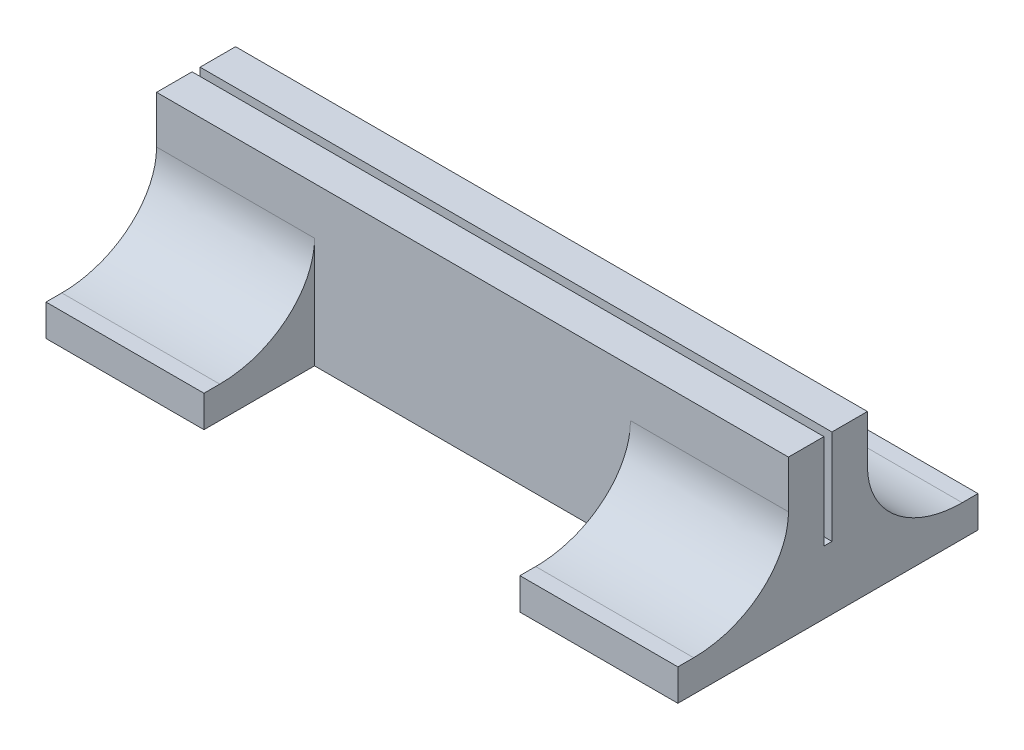
ISO-10303-21;
HEADER;
FILE_DESCRIPTION(('STEP AP214'),'2;1');
FILE_NAME('part.step','',(''),(''),'','','');
FILE_SCHEMA(('AUTOMOTIVE_DESIGN { 1 0 10303 214 1 1 1 1 }'));
ENDSEC;
DATA;
#1=APPLICATION_CONTEXT('core data for automotive mechanical design processes');
#2=APPLICATION_PROTOCOL_DEFINITION('international standard','automotive_design',2000,#1);
#3=PRODUCT_CONTEXT('',#1,'mechanical');
#4=PRODUCT('Part','Part','',(#3));
#5=PRODUCT_RELATED_PRODUCT_CATEGORY('part','',(#4));
#6=PRODUCT_DEFINITION_FORMATION('','',#4);
#7=PRODUCT_DEFINITION_CONTEXT('part definition',#1,'design');
#8=PRODUCT_DEFINITION('design','',#6,#7);
#9=PRODUCT_DEFINITION_SHAPE('','',#8);
#10=(LENGTH_UNIT() NAMED_UNIT(*) SI_UNIT(.MILLI.,.METRE.));
#11=(NAMED_UNIT(*) PLANE_ANGLE_UNIT() SI_UNIT($,.RADIAN.));
#12=(NAMED_UNIT(*) SI_UNIT($,.STERADIAN.) SOLID_ANGLE_UNIT());
#13=UNCERTAINTY_MEASURE_WITH_UNIT(LENGTH_MEASURE(1.E-05),#10,'distance_accuracy_value','');
#14=(GEOMETRIC_REPRESENTATION_CONTEXT(3) GLOBAL_UNCERTAINTY_ASSIGNED_CONTEXT((#13)) GLOBAL_UNIT_ASSIGNED_CONTEXT((#10,
#11,#12)) REPRESENTATION_CONTEXT('',''));
#15=CARTESIAN_POINT('',(0.,0.,0.));
#16=DIRECTION('',(0.,0.,1.));
#17=DIRECTION('',(1.,0.,0.));
#18=AXIS2_PLACEMENT_3D('',#15,#16,#17);
#19=CARTESIAN_POINT('',(-20.,10.,-2.5));
#20=DIRECTION('',(0.,0.,1.));
#21=DIRECTION('',(1.,0.,0.));
#22=AXIS2_PLACEMENT_3D('',#19,#20,#21);
#23=PLANE('',#22);
#24=DIRECTION('',(0.,1.,0.));
#25=VECTOR('',#24,1.);
#26=CARTESIAN_POINT('',(-10.,10.,-2.5));
#27=LINE('',#26,#25);
#28=CARTESIAN_POINT('',(-10.,0.,-2.5));
#29=VERTEX_POINT('',#28);
#30=CARTESIAN_POINT('',(-10.,7.,-2.5));
#31=VERTEX_POINT('',#30);
#32=EDGE_CURVE('E670',#29,#31,#27,.T.);
#33=ORIENTED_EDGE('',*,*,#32,.T.);
#34=CARTESIAN_POINT('',(-20.5,7.,-2.5));
#35=CARTESIAN_POINT('',(-16.8333333333333,7.,-2.5));
#36=CARTESIAN_POINT('',(-13.1666666666667,7.,-2.5));
#37=CARTESIAN_POINT('',(-9.5,7.,-2.5));
#38=(BOUNDED_CURVE() B_SPLINE_CURVE(3,(#34,#35,#36,#37),.UNSPECIFIED.,.F.,
.F.) B_SPLINE_CURVE_WITH_KNOTS((4,4),(-0.0105,0.0005),
.UNSPECIFIED.) CURVE() GEOMETRIC_REPRESENTATION_ITEM() RATIONAL_B_SPLINE_CURVE((1.,1.,1.,1.)) REPRESENTATION_ITEM(''));
#39=CARTESIAN_POINT('',(-20.,7.,-2.5));
#40=VERTEX_POINT('',#39);
#41=EDGE_CURVE('E562',#31,#40,#38,.F.);
#42=ORIENTED_EDGE('',*,*,#41,.T.);
#43=DIRECTION('',(0.,-1.,0.));
#44=VECTOR('',#43,1.);
#45=CARTESIAN_POINT('',(-20.,10.,-2.5));
#46=LINE('',#45,#44);
#47=CARTESIAN_POINT('',(-20.,10.,-2.5));
#48=VERTEX_POINT('',#47);
#49=EDGE_CURVE('E323',#48,#40,#46,.T.);
#50=ORIENTED_EDGE('',*,*,#49,.F.);
#51=DIRECTION('',(-1.,0.,0.));
#52=VECTOR('',#51,1.);
#53=CARTESIAN_POINT('',(-20.,10.,-2.5));
#54=LINE('',#53,#52);
#55=CARTESIAN_POINT('',(20.,10.,-2.5));
#56=VERTEX_POINT('',#55);
#57=EDGE_CURVE('E771',#56,#48,#54,.T.);
#58=ORIENTED_EDGE('',*,*,#57,.F.);
#59=DIRECTION('',(0.,-1.,0.));
#60=VECTOR('',#59,1.);
#61=CARTESIAN_POINT('',(20.,10.,-2.5));
#62=LINE('',#61,#60);
#63=CARTESIAN_POINT('',(20.,7.,-2.5));
#64=VERTEX_POINT('',#63);
#65=EDGE_CURVE('E277',#56,#64,#62,.T.);
#66=ORIENTED_EDGE('',*,*,#65,.T.);
#67=CARTESIAN_POINT('',(9.5,7.,-2.5));
#68=CARTESIAN_POINT('',(13.1666666666667,7.,-2.5));
#69=CARTESIAN_POINT('',(16.8333333333333,7.,-2.5));
#70=CARTESIAN_POINT('',(20.5,7.,-2.5));
#71=(BOUNDED_CURVE() B_SPLINE_CURVE(3,(#67,#68,#69,#70),.UNSPECIFIED.,.F.,
.F.) B_SPLINE_CURVE_WITH_KNOTS((4,4),(-0.0005,0.0105),
.UNSPECIFIED.) CURVE() GEOMETRIC_REPRESENTATION_ITEM() RATIONAL_B_SPLINE_CURVE((1.,1.,1.,1.)) REPRESENTATION_ITEM(''));
#72=CARTESIAN_POINT('',(10.,7.,-2.5));
#73=VERTEX_POINT('',#72);
#74=EDGE_CURVE('E1043',#64,#73,#71,.F.);
#75=ORIENTED_EDGE('',*,*,#74,.T.);
#76=DIRECTION('',(0.,1.,0.));
#77=VECTOR('',#76,1.);
#78=CARTESIAN_POINT('',(10.,10.,-2.5));
#79=LINE('',#78,#77);
#80=CARTESIAN_POINT('',(10.,0.,-2.5));
#81=VERTEX_POINT('',#80);
#82=EDGE_CURVE('E546',#81,#73,#79,.T.);
#83=ORIENTED_EDGE('',*,*,#82,.F.);
#84=DIRECTION('',(-1.,0.,0.));
#85=VECTOR('',#84,1.);
#86=CARTESIAN_POINT('',(-20.,0.,-2.5));
#87=LINE('',#86,#85);
#88=EDGE_CURVE('E759',#81,#29,#87,.T.);
#89=ORIENTED_EDGE('',*,*,#88,.T.);
#90=EDGE_LOOP('',(#33,#42,#50,#58,#66,#75,#83,#89));
#91=FACE_BOUND('',#90,.T.);
#92=ADVANCED_FACE('F38',(#91),#23,.F.);
#93=CARTESIAN_POINT('',(-20.,10.,2.5));
#94=DIRECTION('',(0.,0.,-1.));
#95=DIRECTION('',(-1.,0.,0.));
#96=AXIS2_PLACEMENT_3D('',#93,#94,#95);
#97=PLANE('',#96);
#98=DIRECTION('',(0.,-1.,0.));
#99=VECTOR('',#98,1.);
#100=CARTESIAN_POINT('',(10.,10.,2.5));
#101=LINE('',#100,#99);
#102=CARTESIAN_POINT('',(9.99999999999999,7.,2.5));
#103=VERTEX_POINT('',#102);
#104=CARTESIAN_POINT('',(10.,0.,2.5));
#105=VERTEX_POINT('',#104);
#106=EDGE_CURVE('E249',#103,#105,#101,.T.);
#107=ORIENTED_EDGE('',*,*,#106,.F.);
#108=CARTESIAN_POINT('',(20.5,7.,2.5));
#109=CARTESIAN_POINT('',(16.8333333333333,7.,2.5));
#110=CARTESIAN_POINT('',(13.1666666666667,7.,2.5));
#111=CARTESIAN_POINT('',(9.5,7.,2.5));
#112=(BOUNDED_CURVE() B_SPLINE_CURVE(3,(#108,#109,#110,#111),.UNSPECIFIED.,.F.,
.F.) B_SPLINE_CURVE_WITH_KNOTS((4,4),(-0.0105,0.0005),
.UNSPECIFIED.) CURVE() GEOMETRIC_REPRESENTATION_ITEM() RATIONAL_B_SPLINE_CURVE((1.,1.,1.,1.)) REPRESENTATION_ITEM(''));
#113=CARTESIAN_POINT('',(20.,7.,2.5));
#114=VERTEX_POINT('',#113);
#115=EDGE_CURVE('E1044',#103,#114,#112,.F.);
#116=ORIENTED_EDGE('',*,*,#115,.T.);
#117=DIRECTION('',(0.,-1.,0.));
#118=VECTOR('',#117,1.);
#119=CARTESIAN_POINT('',(20.,10.,2.5));
#120=LINE('',#119,#118);
#121=CARTESIAN_POINT('',(20.,10.,2.5));
#122=VERTEX_POINT('',#121);
#123=EDGE_CURVE('E301',#122,#114,#120,.T.);
#124=ORIENTED_EDGE('',*,*,#123,.F.);
#125=DIRECTION('',(1.,0.,0.));
#126=VECTOR('',#125,1.);
#127=CARTESIAN_POINT('',(-20.,10.,2.5));
#128=LINE('',#127,#126);
#129=CARTESIAN_POINT('',(-20.,10.,2.5));
#130=VERTEX_POINT('',#129);
#131=EDGE_CURVE('E310',#130,#122,#128,.T.);
#132=ORIENTED_EDGE('',*,*,#131,.F.);
#133=DIRECTION('',(0.,-1.,0.));
#134=VECTOR('',#133,1.);
#135=CARTESIAN_POINT('',(-20.,10.,2.5));
#136=LINE('',#135,#134);
#137=CARTESIAN_POINT('',(-20.,7.,2.5));
#138=VERTEX_POINT('',#137);
#139=EDGE_CURVE('E309',#130,#138,#136,.T.);
#140=ORIENTED_EDGE('',*,*,#139,.T.);
#141=CARTESIAN_POINT('',(-9.5,7.,2.5));
#142=CARTESIAN_POINT('',(-13.1666666666667,7.,2.5));
#143=CARTESIAN_POINT('',(-16.8333333333333,7.,2.5));
#144=CARTESIAN_POINT('',(-20.5,7.,2.5));
#145=(BOUNDED_CURVE() B_SPLINE_CURVE(3,(#141,#142,#143,#144),.UNSPECIFIED.,.F.,
.F.) B_SPLINE_CURVE_WITH_KNOTS((4,4),(-0.0005,0.0105),
.UNSPECIFIED.) CURVE() GEOMETRIC_REPRESENTATION_ITEM() RATIONAL_B_SPLINE_CURVE((1.,1.,1.,1.)) REPRESENTATION_ITEM(''));
#146=CARTESIAN_POINT('',(-10.,7.,2.5));
#147=VERTEX_POINT('',#146);
#148=EDGE_CURVE('E330',#138,#147,#145,.F.);
#149=ORIENTED_EDGE('',*,*,#148,.T.);
#150=DIRECTION('',(0.,-1.,0.));
#151=VECTOR('',#150,1.);
#152=CARTESIAN_POINT('',(-10.,10.,2.5));
#153=LINE('',#152,#151);
#154=CARTESIAN_POINT('',(-10.,0.,2.5));
#155=VERTEX_POINT('',#154);
#156=EDGE_CURVE('E677',#147,#155,#153,.T.);
#157=ORIENTED_EDGE('',*,*,#156,.T.);
#158=DIRECTION('',(1.,0.,0.));
#159=VECTOR('',#158,1.);
#160=CARTESIAN_POINT('',(-20.,0.,2.5));
#161=LINE('',#160,#159);
#162=EDGE_CURVE('E315',#155,#105,#161,.T.);
#163=ORIENTED_EDGE('',*,*,#162,.T.);
#164=EDGE_LOOP('',(#107,#116,#124,#132,#140,#149,#157,#163));
#165=FACE_BOUND('',#164,.T.);
#166=ADVANCED_FACE('F338',(#165),#97,.F.);
#167=CARTESIAN_POINT('',(0.,10.,0.));
#168=DIRECTION('',(0.,1.,0.));
#169=DIRECTION('',(0.,0.,1.));
#170=AXIS2_PLACEMENT_3D('',#167,#168,#169);
#171=PLANE('',#170);
#172=DIRECTION('',(-1.,0.,0.));
#173=VECTOR('',#172,1.);
#174=CARTESIAN_POINT('',(20.,10.,-0.254179669127552));
#175=LINE('',#174,#173);
#176=CARTESIAN_POINT('',(20.,10.,-0.254179669127552));
#177=VERTEX_POINT('',#176);
#178=CARTESIAN_POINT('',(-20.,10.,-0.254179669127552));
#179=VERTEX_POINT('',#178);
#180=EDGE_CURVE('E678',#177,#179,#175,.T.);
#181=ORIENTED_EDGE('',*,*,#180,.F.);
#182=DIRECTION('',(0.,0.,-1.));
#183=VECTOR('',#182,1.);
#184=CARTESIAN_POINT('',(20.,10.,-2.5));
#185=LINE('',#184,#183);
#186=EDGE_CURVE('E764',#177,#56,#185,.T.);
#187=ORIENTED_EDGE('',*,*,#186,.T.);
#188=ORIENTED_EDGE('',*,*,#57,.T.);
#189=DIRECTION('',(0.,0.,1.));
#190=VECTOR('',#189,1.);
#191=CARTESIAN_POINT('',(-20.,10.,-2.5));
#192=LINE('',#191,#190);
#193=EDGE_CURVE('E750',#48,#179,#192,.T.);
#194=ORIENTED_EDGE('',*,*,#193,.T.);
#195=EDGE_LOOP('',(#181,#187,#188,#194));
#196=FACE_BOUND('',#195,.T.);
#197=ADVANCED_FACE('F348',(#196),#171,.T.);
#198=CARTESIAN_POINT('',(20.,10.,-2.5));
#199=DIRECTION('',(-1.,0.,0.));
#200=DIRECTION('',(0.,0.,1.));
#201=AXIS2_PLACEMENT_3D('',#198,#199,#200);
#202=PLANE('',#201);
#203=DIRECTION('',(0.,0.,-1.));
#204=VECTOR('',#203,1.);
#205=CARTESIAN_POINT('',(20.,0.,-2.5));
#206=LINE('',#205,#204);
#207=CARTESIAN_POINT('',(20.,0.,9.5));
#208=VERTEX_POINT('',#207);
#209=CARTESIAN_POINT('',(20.,0.,-9.5));
#210=VERTEX_POINT('',#209);
#211=EDGE_CURVE('E757',#208,#210,#206,.T.);
#212=ORIENTED_EDGE('',*,*,#211,.T.);
#213=DIRECTION('',(0.,-1.,0.));
#214=VECTOR('',#213,1.);
#215=CARTESIAN_POINT('',(20.,0.,-9.5));
#216=LINE('',#215,#214);
#217=CARTESIAN_POINT('',(20.,2.,-9.5));
#218=VERTEX_POINT('',#217);
#219=EDGE_CURVE('E238',#218,#210,#216,.T.);
#220=ORIENTED_EDGE('',*,*,#219,.F.);
#221=DIRECTION('',(0.,0.,1.));
#222=VECTOR('',#221,1.);
#223=CARTESIAN_POINT('',(20.,2.,-9.5));
#224=LINE('',#223,#222);
#225=CARTESIAN_POINT('',(20.,2.,-8.5));
#226=VERTEX_POINT('',#225);
#227=EDGE_CURVE('E218',#218,#226,#224,.T.);
#228=ORIENTED_EDGE('',*,*,#227,.T.);
#229=CARTESIAN_POINT('',(20.,7.,-2.5));
#230=CARTESIAN_POINT('',(20.,2.,-2.5));
#231=CARTESIAN_POINT('',(20.,2.,-8.5));
#232=(BOUNDED_CURVE() B_SPLINE_CURVE(2,(#229,#230,#231),.UNSPECIFIED.,.F.,
.F.) B_SPLINE_CURVE_WITH_KNOTS((3,3),(0.,1.),
.UNSPECIFIED.) CURVE() GEOMETRIC_REPRESENTATION_ITEM() RATIONAL_B_SPLINE_CURVE((1.,
0.707106781186548,1.)) REPRESENTATION_ITEM(''));
#233=EDGE_CURVE('E425',#226,#64,#232,.F.);
#234=ORIENTED_EDGE('',*,*,#233,.T.);
#235=ORIENTED_EDGE('',*,*,#65,.F.);
#236=ORIENTED_EDGE('',*,*,#186,.F.);
#237=DIRECTION('',(0.,1.,0.));
#238=VECTOR('',#237,1.);
#239=CARTESIAN_POINT('',(20.,4.,-0.254179669127552));
#240=LINE('',#239,#238);
#241=CARTESIAN_POINT('',(20.,4.,-0.254179669127552));
#242=VERTEX_POINT('',#241);
#243=EDGE_CURVE('E786',#242,#177,#240,.T.);
#244=ORIENTED_EDGE('',*,*,#243,.F.);
#245=DIRECTION('',(0.,0.,-1.));
#246=VECTOR('',#245,1.);
#247=CARTESIAN_POINT('',(20.,4.,0.254179669127552));
#248=LINE('',#247,#246);
#249=CARTESIAN_POINT('',(20.,4.,0.254179669127552));
#250=VERTEX_POINT('',#249);
#251=EDGE_CURVE('E788',#250,#242,#248,.T.);
#252=ORIENTED_EDGE('',*,*,#251,.F.);
#253=DIRECTION('',(0.,1.,0.));
#254=VECTOR('',#253,1.);
#255=CARTESIAN_POINT('',(20.,4.,0.254179669127552));
#256=LINE('',#255,#254);
#257=CARTESIAN_POINT('',(20.,10.,0.254179669127552));
#258=VERTEX_POINT('',#257);
#259=EDGE_CURVE('E783',#250,#258,#256,.T.);
#260=ORIENTED_EDGE('',*,*,#259,.T.);
#261=EDGE_CURVE('E765',#122,#258,#185,.T.);
#262=ORIENTED_EDGE('',*,*,#261,.F.);
#263=ORIENTED_EDGE('',*,*,#123,.T.);
#264=CARTESIAN_POINT('',(20.,2.,8.5));
#265=CARTESIAN_POINT('',(20.,2.,2.5));
#266=CARTESIAN_POINT('',(20.,7.,2.5));
#267=(BOUNDED_CURVE() B_SPLINE_CURVE(2,(#264,#265,#266),.UNSPECIFIED.,.F.,
.F.) B_SPLINE_CURVE_WITH_KNOTS((3,3),(0.,1.),
.UNSPECIFIED.) CURVE() GEOMETRIC_REPRESENTATION_ITEM() RATIONAL_B_SPLINE_CURVE((1.,
0.707106781186548,1.)) REPRESENTATION_ITEM(''));
#268=CARTESIAN_POINT('',(20.,2.,8.5));
#269=VERTEX_POINT('',#268);
#270=EDGE_CURVE('E212',#114,#269,#267,.F.);
#271=ORIENTED_EDGE('',*,*,#270,.T.);
#272=CARTESIAN_POINT('',(20.,2.,9.5));
#273=VERTEX_POINT('',#272);
#274=EDGE_CURVE('E205',#269,#273,#224,.T.);
#275=ORIENTED_EDGE('',*,*,#274,.T.);
#276=DIRECTION('',(0.,-1.,0.));
#277=VECTOR('',#276,1.);
#278=CARTESIAN_POINT('',(20.,0.,9.5));
#279=LINE('',#278,#277);
#280=EDGE_CURVE('E208',#273,#208,#279,.T.);
#281=ORIENTED_EDGE('',*,*,#280,.T.);
#282=EDGE_LOOP('',(#212,#220,#228,#234,#235,#236,#244,#252,#260,#262,#263,#271,#275,#281));
#283=FACE_BOUND('',#282,.T.);
#284=ADVANCED_FACE('F207',(#283),#202,.F.);
#285=CARTESIAN_POINT('',(-20.,10.,-2.5));
#286=DIRECTION('',(1.,0.,0.));
#287=DIRECTION('',(0.,0.,-1.));
#288=AXIS2_PLACEMENT_3D('',#285,#286,#287);
#289=PLANE('',#288);
#290=ORIENTED_EDGE('',*,*,#49,.T.);
#291=CARTESIAN_POINT('',(-20.,2.,-8.5));
#292=CARTESIAN_POINT('',(-20.,2.,-2.5));
#293=CARTESIAN_POINT('',(-20.,7.,-2.5));
#294=(BOUNDED_CURVE() B_SPLINE_CURVE(2,(#291,#292,#293),.UNSPECIFIED.,.F.,
.F.) B_SPLINE_CURVE_WITH_KNOTS((3,3),(0.,1.),
.UNSPECIFIED.) CURVE() GEOMETRIC_REPRESENTATION_ITEM() RATIONAL_B_SPLINE_CURVE((1.,
0.707106781186548,1.)) REPRESENTATION_ITEM(''));
#295=CARTESIAN_POINT('',(-20.,2.,-8.5));
#296=VERTEX_POINT('',#295);
#297=EDGE_CURVE('E51',#40,#296,#294,.F.);
#298=ORIENTED_EDGE('',*,*,#297,.T.);
#299=DIRECTION('',(0.,0.,1.));
#300=VECTOR('',#299,1.);
#301=CARTESIAN_POINT('',(-20.,2.,-9.5));
#302=LINE('',#301,#300);
#303=CARTESIAN_POINT('',(-20.,2.,-9.5));
#304=VERTEX_POINT('',#303);
#305=EDGE_CURVE('E575',#304,#296,#302,.T.);
#306=ORIENTED_EDGE('',*,*,#305,.F.);
#307=DIRECTION('',(0.,-1.,0.));
#308=VECTOR('',#307,1.);
#309=CARTESIAN_POINT('',(-20.,0.,-9.5));
#310=LINE('',#309,#308);
#311=CARTESIAN_POINT('',(-20.,0.,-9.5));
#312=VERTEX_POINT('',#311);
#313=EDGE_CURVE('E815',#304,#312,#310,.T.);
#314=ORIENTED_EDGE('',*,*,#313,.T.);
#315=DIRECTION('',(0.,0.,1.));
#316=VECTOR('',#315,1.);
#317=CARTESIAN_POINT('',(-20.,0.,-2.5));
#318=LINE('',#317,#316);
#319=CARTESIAN_POINT('',(-20.,0.,9.5));
#320=VERTEX_POINT('',#319);
#321=EDGE_CURVE('E761',#312,#320,#318,.T.);
#322=ORIENTED_EDGE('',*,*,#321,.T.);
#323=DIRECTION('',(0.,-1.,0.));
#324=VECTOR('',#323,1.);
#325=CARTESIAN_POINT('',(-20.,0.,9.5));
#326=LINE('',#325,#324);
#327=CARTESIAN_POINT('',(-20.,2.,9.5));
#328=VERTEX_POINT('',#327);
#329=EDGE_CURVE('E553',#328,#320,#326,.T.);
#330=ORIENTED_EDGE('',*,*,#329,.F.);
#331=CARTESIAN_POINT('',(-20.,2.,8.5));
#332=VERTEX_POINT('',#331);
#333=EDGE_CURVE('E335',#332,#328,#302,.T.);
#334=ORIENTED_EDGE('',*,*,#333,.F.);
#335=CARTESIAN_POINT('',(-20.,7.,2.5));
#336=CARTESIAN_POINT('',(-20.,2.,2.5));
#337=CARTESIAN_POINT('',(-20.,2.,8.5));
#338=(BOUNDED_CURVE() B_SPLINE_CURVE(2,(#335,#336,#337),.UNSPECIFIED.,.F.,
.F.) B_SPLINE_CURVE_WITH_KNOTS((3,3),(0.,1.),
.UNSPECIFIED.) CURVE() GEOMETRIC_REPRESENTATION_ITEM() RATIONAL_B_SPLINE_CURVE((1.,
0.707106781186547,1.)) REPRESENTATION_ITEM(''));
#339=EDGE_CURVE('E706',#332,#138,#338,.F.);
#340=ORIENTED_EDGE('',*,*,#339,.T.);
#341=ORIENTED_EDGE('',*,*,#139,.F.);
#342=CARTESIAN_POINT('',(-20.,10.,0.254179669127552));
#343=VERTEX_POINT('',#342);
#344=EDGE_CURVE('E753',#343,#130,#192,.T.);
#345=ORIENTED_EDGE('',*,*,#344,.F.);
#346=DIRECTION('',(0.,1.,0.));
#347=VECTOR('',#346,1.);
#348=CARTESIAN_POINT('',(-20.,4.,0.254179669127552));
#349=LINE('',#348,#347);
#350=CARTESIAN_POINT('',(-20.,4.,0.254179669127552));
#351=VERTEX_POINT('',#350);
#352=EDGE_CURVE('E773',#351,#343,#349,.T.);
#353=ORIENTED_EDGE('',*,*,#352,.F.);
#354=DIRECTION('',(0.,0.,1.));
#355=VECTOR('',#354,1.);
#356=CARTESIAN_POINT('',(-20.,4.,0.254179669127552));
#357=LINE('',#356,#355);
#358=CARTESIAN_POINT('',(-20.,4.,-0.254179669127552));
#359=VERTEX_POINT('',#358);
#360=EDGE_CURVE('E781',#359,#351,#357,.T.);
#361=ORIENTED_EDGE('',*,*,#360,.F.);
#362=DIRECTION('',(0.,1.,0.));
#363=VECTOR('',#362,1.);
#364=CARTESIAN_POINT('',(-20.,4.,-0.254179669127552));
#365=LINE('',#364,#363);
#366=EDGE_CURVE('E760',#359,#179,#365,.T.);
#367=ORIENTED_EDGE('',*,*,#366,.T.);
#368=ORIENTED_EDGE('',*,*,#193,.F.);
#369=EDGE_LOOP('',(#290,#298,#306,#314,#322,#330,#334,#340,#341,#345,#353,#361,#367,#368));
#370=FACE_BOUND('',#369,.T.);
#371=ADVANCED_FACE('F351',(#370),#289,.F.);
#372=DIRECTION('',(1.,0.,0.));
#373=VECTOR('',#372,1.);
#374=CARTESIAN_POINT('',(20.,10.,0.254179669127552));
#375=LINE('',#374,#373);
#376=EDGE_CURVE('E676',#343,#258,#375,.T.);
#377=ORIENTED_EDGE('',*,*,#376,.F.);
#378=ORIENTED_EDGE('',*,*,#344,.T.);
#379=ORIENTED_EDGE('',*,*,#131,.T.);
#380=ORIENTED_EDGE('',*,*,#261,.T.);
#381=EDGE_LOOP('',(#377,#378,#379,#380));
#382=FACE_BOUND('',#381,.T.);
#383=ADVANCED_FACE('F776',(#382),#171,.T.);
#384=CARTESIAN_POINT('',(0.,0.,0.));
#385=DIRECTION('',(0.,1.,0.));
#386=DIRECTION('',(0.,0.,1.));
#387=AXIS2_PLACEMENT_3D('',#384,#385,#386);
#388=PLANE('',#387);
#389=ORIENTED_EDGE('',*,*,#211,.F.);
#390=DIRECTION('',(-1.,0.,0.));
#391=VECTOR('',#390,1.);
#392=CARTESIAN_POINT('',(20.,0.,9.5));
#393=LINE('',#392,#391);
#394=CARTESIAN_POINT('',(10.,0.,9.5));
#395=VERTEX_POINT('',#394);
#396=EDGE_CURVE('E228',#208,#395,#393,.T.);
#397=ORIENTED_EDGE('',*,*,#396,.T.);
#398=DIRECTION('',(0.,0.,1.));
#399=VECTOR('',#398,1.);
#400=CARTESIAN_POINT('',(10.,0.,-9.5));
#401=LINE('',#400,#399);
#402=EDGE_CURVE('E250',#105,#395,#401,.T.);
#403=ORIENTED_EDGE('',*,*,#402,.F.);
#404=ORIENTED_EDGE('',*,*,#162,.F.);
#405=DIRECTION('',(0.,0.,1.));
#406=VECTOR('',#405,1.);
#407=CARTESIAN_POINT('',(-10.,0.,-9.5));
#408=LINE('',#407,#406);
#409=CARTESIAN_POINT('',(-10.,0.,9.5));
#410=VERTEX_POINT('',#409);
#411=EDGE_CURVE('E830',#155,#410,#408,.T.);
#412=ORIENTED_EDGE('',*,*,#411,.T.);
#413=DIRECTION('',(1.,0.,0.));
#414=VECTOR('',#413,1.);
#415=CARTESIAN_POINT('',(-20.,0.,9.5));
#416=LINE('',#415,#414);
#417=EDGE_CURVE('E820',#320,#410,#416,.T.);
#418=ORIENTED_EDGE('',*,*,#417,.F.);
#419=ORIENTED_EDGE('',*,*,#321,.F.);
#420=DIRECTION('',(1.,0.,0.));
#421=VECTOR('',#420,1.);
#422=CARTESIAN_POINT('',(-20.,0.,-9.5));
#423=LINE('',#422,#421);
#424=CARTESIAN_POINT('',(-10.,0.,-9.5));
#425=VERTEX_POINT('',#424);
#426=EDGE_CURVE('E818',#312,#425,#423,.T.);
#427=ORIENTED_EDGE('',*,*,#426,.T.);
#428=EDGE_CURVE('E580',#425,#29,#408,.T.);
#429=ORIENTED_EDGE('',*,*,#428,.T.);
#430=ORIENTED_EDGE('',*,*,#88,.F.);
#431=CARTESIAN_POINT('',(10.,0.,-9.5));
#432=VERTEX_POINT('',#431);
#433=EDGE_CURVE('E246',#432,#81,#401,.T.);
#434=ORIENTED_EDGE('',*,*,#433,.F.);
#435=DIRECTION('',(-1.,0.,0.));
#436=VECTOR('',#435,1.);
#437=CARTESIAN_POINT('',(20.,0.,-9.5));
#438=LINE('',#437,#436);
#439=EDGE_CURVE('E219',#210,#432,#438,.T.);
#440=ORIENTED_EDGE('',*,*,#439,.F.);
#441=EDGE_LOOP('',(#389,#397,#403,#404,#412,#418,#419,#427,#429,#430,#434,#440));
#442=FACE_BOUND('',#441,.T.);
#443=ADVANCED_FACE('F349',(#442),#388,.F.);
#444=CARTESIAN_POINT('',(20.,4.,-0.254179669127552));
#445=DIRECTION('',(0.,0.,-1.));
#446=DIRECTION('',(-1.,0.,0.));
#447=AXIS2_PLACEMENT_3D('',#444,#445,#446);
#448=PLANE('',#447);
#449=ORIENTED_EDGE('',*,*,#180,.T.);
#450=ORIENTED_EDGE('',*,*,#366,.F.);
#451=DIRECTION('',(-1.,0.,0.));
#452=VECTOR('',#451,1.);
#453=CARTESIAN_POINT('',(20.,4.,-0.254179669127552));
#454=LINE('',#453,#452);
#455=EDGE_CURVE('E784',#242,#359,#454,.T.);
#456=ORIENTED_EDGE('',*,*,#455,.F.);
#457=ORIENTED_EDGE('',*,*,#243,.T.);
#458=EDGE_LOOP('',(#449,#450,#456,#457));
#459=FACE_BOUND('',#458,.T.);
#460=ADVANCED_FACE('F800',(#459),#448,.F.);
#461=CARTESIAN_POINT('',(20.,4.,0.254179669127552));
#462=DIRECTION('',(0.,0.,1.));
#463=DIRECTION('',(1.,0.,0.));
#464=AXIS2_PLACEMENT_3D('',#461,#462,#463);
#465=PLANE('',#464);
#466=ORIENTED_EDGE('',*,*,#376,.T.);
#467=ORIENTED_EDGE('',*,*,#259,.F.);
#468=DIRECTION('',(1.,0.,0.));
#469=VECTOR('',#468,1.);
#470=CARTESIAN_POINT('',(20.,4.,0.254179669127552));
#471=LINE('',#470,#469);
#472=EDGE_CURVE('E792',#351,#250,#471,.T.);
#473=ORIENTED_EDGE('',*,*,#472,.F.);
#474=ORIENTED_EDGE('',*,*,#352,.T.);
#475=EDGE_LOOP('',(#466,#467,#473,#474));
#476=FACE_BOUND('',#475,.T.);
#477=ADVANCED_FACE('F891',(#476),#465,.F.);
#478=CARTESIAN_POINT('',(0.,4.,0.));
#479=DIRECTION('',(0.,1.,0.));
#480=DIRECTION('',(0.,0.,1.));
#481=AXIS2_PLACEMENT_3D('',#478,#479,#480);
#482=PLANE('',#481);
#483=ORIENTED_EDGE('',*,*,#360,.T.);
#484=ORIENTED_EDGE('',*,*,#472,.T.);
#485=ORIENTED_EDGE('',*,*,#251,.T.);
#486=ORIENTED_EDGE('',*,*,#455,.T.);
#487=EDGE_LOOP('',(#483,#484,#485,#486));
#488=FACE_BOUND('',#487,.T.);
#489=ADVANCED_FACE('F898',(#488),#482,.T.);
#490=CARTESIAN_POINT('',(0.,0.,9.5));
#491=DIRECTION('',(0.,0.,-1.));
#492=DIRECTION('',(-1.,0.,0.));
#493=AXIS2_PLACEMENT_3D('',#490,#491,#492);
#494=PLANE('',#493);
#495=ORIENTED_EDGE('',*,*,#329,.T.);
#496=ORIENTED_EDGE('',*,*,#417,.T.);
#497=DIRECTION('',(0.,1.,0.));
#498=VECTOR('',#497,1.);
#499=CARTESIAN_POINT('',(-10.,0.,9.5));
#500=LINE('',#499,#498);
#501=CARTESIAN_POINT('',(-10.,2.,9.5));
#502=VERTEX_POINT('',#501);
#503=EDGE_CURVE('E816',#410,#502,#500,.T.);
#504=ORIENTED_EDGE('',*,*,#503,.T.);
#505=DIRECTION('',(-1.,0.,0.));
#506=VECTOR('',#505,1.);
#507=CARTESIAN_POINT('',(-20.,2.,9.5));
#508=LINE('',#507,#506);
#509=EDGE_CURVE('E812',#502,#328,#508,.T.);
#510=ORIENTED_EDGE('',*,*,#509,.T.);
#511=EDGE_LOOP('',(#495,#496,#504,#510));
#512=FACE_BOUND('',#511,.T.);
#513=ADVANCED_FACE('F294',(#512),#494,.F.);
#514=CARTESIAN_POINT('',(-10.,0.,-9.5));
#515=DIRECTION('',(1.,0.,0.));
#516=DIRECTION('',(0.,0.,-1.));
#517=AXIS2_PLACEMENT_3D('',#514,#515,#516);
#518=PLANE('',#517);
#519=ORIENTED_EDGE('',*,*,#156,.F.);
#520=CARTESIAN_POINT('',(-10.,2.,8.5));
#521=CARTESIAN_POINT('',(-10.,2.,2.5));
#522=CARTESIAN_POINT('',(-10.,7.,2.5));
#523=(BOUNDED_CURVE() B_SPLINE_CURVE(2,(#520,#521,#522),.UNSPECIFIED.,.F.,
.F.) B_SPLINE_CURVE_WITH_KNOTS((3,3),(0.,1.),
.UNSPECIFIED.) CURVE() GEOMETRIC_REPRESENTATION_ITEM() RATIONAL_B_SPLINE_CURVE((1.,
0.707106781186548,1.)) REPRESENTATION_ITEM(''));
#524=CARTESIAN_POINT('',(-10.,2.,8.5));
#525=VERTEX_POINT('',#524);
#526=EDGE_CURVE('E725',#147,#525,#523,.F.);
#527=ORIENTED_EDGE('',*,*,#526,.T.);
#528=DIRECTION('',(0.,0.,1.));
#529=VECTOR('',#528,1.);
#530=CARTESIAN_POINT('',(-10.,2.,-9.5));
#531=LINE('',#530,#529);
#532=EDGE_CURVE('E574',#525,#502,#531,.T.);
#533=ORIENTED_EDGE('',*,*,#532,.T.);
#534=ORIENTED_EDGE('',*,*,#503,.F.);
#535=ORIENTED_EDGE('',*,*,#411,.F.);
#536=EDGE_LOOP('',(#519,#527,#533,#534,#535));
#537=FACE_BOUND('',#536,.T.);
#538=ADVANCED_FACE('F807',(#537),#518,.T.);
#539=CARTESIAN_POINT('',(-20.,2.,-9.5));
#540=DIRECTION('',(0.,1.,0.));
#541=DIRECTION('',(0.,0.,1.));
#542=AXIS2_PLACEMENT_3D('',#539,#540,#541);
#543=PLANE('',#542);
#544=ORIENTED_EDGE('',*,*,#532,.F.);
#545=CARTESIAN_POINT('',(-20.5,2.,8.5));
#546=CARTESIAN_POINT('',(-16.8333333333333,2.,8.5));
#547=CARTESIAN_POINT('',(-13.1666666666667,2.,8.5));
#548=CARTESIAN_POINT('',(-9.5,2.,8.5));
#549=(BOUNDED_CURVE() B_SPLINE_CURVE(3,(#545,#546,#547,#548),.UNSPECIFIED.,.F.,
.F.) B_SPLINE_CURVE_WITH_KNOTS((4,4),(-0.0005,0.0105),
.UNSPECIFIED.) CURVE() GEOMETRIC_REPRESENTATION_ITEM() RATIONAL_B_SPLINE_CURVE((1.,1.,1.,1.)) REPRESENTATION_ITEM(''));
#550=EDGE_CURVE('E588',#525,#332,#549,.F.);
#551=ORIENTED_EDGE('',*,*,#550,.T.);
#552=ORIENTED_EDGE('',*,*,#333,.T.);
#553=ORIENTED_EDGE('',*,*,#509,.F.);
#554=EDGE_LOOP('',(#544,#551,#552,#553));
#555=FACE_BOUND('',#554,.T.);
#556=ADVANCED_FACE('F605',(#555),#543,.T.);
#557=ORIENTED_EDGE('',*,*,#305,.T.);
#558=CARTESIAN_POINT('',(-9.5,2.,-8.5));
#559=CARTESIAN_POINT('',(-13.1666666666667,2.,-8.5));
#560=CARTESIAN_POINT('',(-16.8333333333333,2.,-8.5));
#561=CARTESIAN_POINT('',(-20.5,2.,-8.5));
#562=(BOUNDED_CURVE() B_SPLINE_CURVE(3,(#558,#559,#560,#561),.UNSPECIFIED.,.F.,
.F.) B_SPLINE_CURVE_WITH_KNOTS((4,4),(-0.0105,0.0005),
.UNSPECIFIED.) CURVE() GEOMETRIC_REPRESENTATION_ITEM() RATIONAL_B_SPLINE_CURVE((1.,1.,1.,1.)) REPRESENTATION_ITEM(''));
#563=CARTESIAN_POINT('',(-10.,2.,-8.5));
#564=VERTEX_POINT('',#563);
#565=EDGE_CURVE('E65',#296,#564,#562,.F.);
#566=ORIENTED_EDGE('',*,*,#565,.T.);
#567=CARTESIAN_POINT('',(-10.,2.,-9.5));
#568=VERTEX_POINT('',#567);
#569=EDGE_CURVE('E566',#568,#564,#531,.T.);
#570=ORIENTED_EDGE('',*,*,#569,.F.);
#571=DIRECTION('',(-1.,0.,0.));
#572=VECTOR('',#571,1.);
#573=CARTESIAN_POINT('',(-20.,2.,-9.5));
#574=LINE('',#573,#572);
#575=EDGE_CURVE('E828',#568,#304,#574,.T.);
#576=ORIENTED_EDGE('',*,*,#575,.T.);
#577=EDGE_LOOP('',(#557,#566,#570,#576));
#578=FACE_BOUND('',#577,.T.);
#579=ADVANCED_FACE('F595',(#578),#543,.T.);
#580=ORIENTED_EDGE('',*,*,#32,.F.);
#581=ORIENTED_EDGE('',*,*,#428,.F.);
#582=DIRECTION('',(0.,1.,0.));
#583=VECTOR('',#582,1.);
#584=CARTESIAN_POINT('',(-10.,0.,-9.5));
#585=LINE('',#584,#583);
#586=EDGE_CURVE('E826',#425,#568,#585,.T.);
#587=ORIENTED_EDGE('',*,*,#586,.T.);
#588=ORIENTED_EDGE('',*,*,#569,.T.);
#589=CARTESIAN_POINT('',(-10.,7.,-2.5));
#590=CARTESIAN_POINT('',(-10.,2.,-2.5));
#591=CARTESIAN_POINT('',(-10.,2.,-8.5));
#592=(BOUNDED_CURVE() B_SPLINE_CURVE(2,(#589,#590,#591),.UNSPECIFIED.,.F.,
.F.) B_SPLINE_CURVE_WITH_KNOTS((3,3),(0.,1.),
.UNSPECIFIED.) CURVE() GEOMETRIC_REPRESENTATION_ITEM() RATIONAL_B_SPLINE_CURVE((1.,
0.707106781186548,1.)) REPRESENTATION_ITEM(''));
#593=EDGE_CURVE('E12',#564,#31,#592,.F.);
#594=ORIENTED_EDGE('',*,*,#593,.T.);
#595=EDGE_LOOP('',(#580,#581,#587,#588,#594));
#596=FACE_BOUND('',#595,.T.);
#597=ADVANCED_FACE('F604',(#596),#518,.T.);
#598=CARTESIAN_POINT('',(0.,0.,-9.5));
#599=DIRECTION('',(0.,0.,-1.));
#600=DIRECTION('',(-1.,0.,0.));
#601=AXIS2_PLACEMENT_3D('',#598,#599,#600);
#602=PLANE('',#601);
#603=ORIENTED_EDGE('',*,*,#313,.F.);
#604=ORIENTED_EDGE('',*,*,#575,.F.);
#605=ORIENTED_EDGE('',*,*,#586,.F.);
#606=ORIENTED_EDGE('',*,*,#426,.F.);
#607=EDGE_LOOP('',(#603,#604,#605,#606));
#608=FACE_BOUND('',#607,.T.);
#609=ADVANCED_FACE('F606',(#608),#602,.T.);
#610=CARTESIAN_POINT('',(0.,0.,9.5));
#611=DIRECTION('',(0.,0.,-1.));
#612=DIRECTION('',(1.,0.,0.));
#613=AXIS2_PLACEMENT_3D('',#610,#611,#612);
#614=PLANE('',#613);
#615=ORIENTED_EDGE('',*,*,#280,.F.);
#616=DIRECTION('',(1.,0.,0.));
#617=VECTOR('',#616,1.);
#618=CARTESIAN_POINT('',(20.,2.,9.5));
#619=LINE('',#618,#617);
#620=CARTESIAN_POINT('',(10.,2.,9.5));
#621=VERTEX_POINT('',#620);
#622=EDGE_CURVE('E225',#621,#273,#619,.T.);
#623=ORIENTED_EDGE('',*,*,#622,.F.);
#624=DIRECTION('',(0.,1.,0.));
#625=VECTOR('',#624,1.);
#626=CARTESIAN_POINT('',(10.,0.,9.5));
#627=LINE('',#626,#625);
#628=EDGE_CURVE('E233',#395,#621,#627,.T.);
#629=ORIENTED_EDGE('',*,*,#628,.F.);
#630=ORIENTED_EDGE('',*,*,#396,.F.);
#631=EDGE_LOOP('',(#615,#623,#629,#630));
#632=FACE_BOUND('',#631,.T.);
#633=ADVANCED_FACE('F223',(#632),#614,.F.);
#634=CARTESIAN_POINT('',(20.,2.,-9.5));
#635=DIRECTION('',(0.,-1.,0.));
#636=DIRECTION('',(0.,0.,-1.));
#637=AXIS2_PLACEMENT_3D('',#634,#635,#636);
#638=PLANE('',#637);
#639=ORIENTED_EDGE('',*,*,#274,.F.);
#640=CARTESIAN_POINT('',(9.5,2.,8.5));
#641=CARTESIAN_POINT('',(13.1666666666667,2.,8.5));
#642=CARTESIAN_POINT('',(16.8333333333333,2.,8.5));
#643=CARTESIAN_POINT('',(20.5,2.,8.5));
#644=(BOUNDED_CURVE() B_SPLINE_CURVE(3,(#640,#641,#642,#643),.UNSPECIFIED.,.F.,
.F.) B_SPLINE_CURVE_WITH_KNOTS((4,4),(-0.0105,0.0005),
.UNSPECIFIED.) CURVE() GEOMETRIC_REPRESENTATION_ITEM() RATIONAL_B_SPLINE_CURVE((1.,1.,1.,1.)) REPRESENTATION_ITEM(''));
#645=CARTESIAN_POINT('',(10.,2.,8.5));
#646=VERTEX_POINT('',#645);
#647=EDGE_CURVE('E745',#269,#646,#644,.F.);
#648=ORIENTED_EDGE('',*,*,#647,.T.);
#649=DIRECTION('',(0.,0.,1.));
#650=VECTOR('',#649,1.);
#651=CARTESIAN_POINT('',(10.,2.,-9.5));
#652=LINE('',#651,#650);
#653=EDGE_CURVE('E232',#646,#621,#652,.T.);
#654=ORIENTED_EDGE('',*,*,#653,.T.);
#655=ORIENTED_EDGE('',*,*,#622,.T.);
#656=EDGE_LOOP('',(#639,#648,#654,#655));
#657=FACE_BOUND('',#656,.T.);
#658=ADVANCED_FACE('F230',(#657),#638,.F.);
#659=CARTESIAN_POINT('',(10.,0.,-9.5));
#660=DIRECTION('',(1.,0.,0.));
#661=DIRECTION('',(0.,0.,-1.));
#662=AXIS2_PLACEMENT_3D('',#659,#660,#661);
#663=PLANE('',#662);
#664=ORIENTED_EDGE('',*,*,#653,.F.);
#665=CARTESIAN_POINT('',(10.,7.,2.5));
#666=CARTESIAN_POINT('',(10.,2.,2.5));
#667=CARTESIAN_POINT('',(10.,2.,8.5));
#668=(BOUNDED_CURVE() B_SPLINE_CURVE(2,(#665,#666,#667),.UNSPECIFIED.,.F.,
.F.) B_SPLINE_CURVE_WITH_KNOTS((3,3),(0.,1.),
.UNSPECIFIED.) CURVE() GEOMETRIC_REPRESENTATION_ITEM() RATIONAL_B_SPLINE_CURVE((1.,
0.707106781186548,1.)) REPRESENTATION_ITEM(''));
#669=EDGE_CURVE('E367',#646,#103,#668,.F.);
#670=ORIENTED_EDGE('',*,*,#669,.T.);
#671=ORIENTED_EDGE('',*,*,#106,.T.);
#672=ORIENTED_EDGE('',*,*,#402,.T.);
#673=ORIENTED_EDGE('',*,*,#628,.T.);
#674=EDGE_LOOP('',(#664,#670,#671,#672,#673));
#675=FACE_BOUND('',#674,.T.);
#676=ADVANCED_FACE('F291',(#675),#663,.F.);
#677=CARTESIAN_POINT('',(10.,2.,-9.5));
#678=VERTEX_POINT('',#677);
#679=CARTESIAN_POINT('',(10.,2.,-8.5));
#680=VERTEX_POINT('',#679);
#681=EDGE_CURVE('E259',#678,#680,#652,.T.);
#682=ORIENTED_EDGE('',*,*,#681,.T.);
#683=CARTESIAN_POINT('',(20.5,2.,-8.5));
#684=CARTESIAN_POINT('',(16.8333333333333,2.,-8.5));
#685=CARTESIAN_POINT('',(13.1666666666667,2.,-8.5));
#686=CARTESIAN_POINT('',(9.5,2.,-8.5));
#687=(BOUNDED_CURVE() B_SPLINE_CURVE(3,(#683,#684,#685,#686),.UNSPECIFIED.,.F.,
.F.) B_SPLINE_CURVE_WITH_KNOTS((4,4),(-0.0005,0.0105),
.UNSPECIFIED.) CURVE() GEOMETRIC_REPRESENTATION_ITEM() RATIONAL_B_SPLINE_CURVE((1.,1.,1.,1.)) REPRESENTATION_ITEM(''));
#688=EDGE_CURVE('E272',#680,#226,#687,.F.);
#689=ORIENTED_EDGE('',*,*,#688,.T.);
#690=ORIENTED_EDGE('',*,*,#227,.F.);
#691=DIRECTION('',(1.,0.,0.));
#692=VECTOR('',#691,1.);
#693=CARTESIAN_POINT('',(20.,2.,-9.5));
#694=LINE('',#693,#692);
#695=EDGE_CURVE('E241',#678,#218,#694,.T.);
#696=ORIENTED_EDGE('',*,*,#695,.F.);
#697=EDGE_LOOP('',(#682,#689,#690,#696));
#698=FACE_BOUND('',#697,.T.);
#699=ADVANCED_FACE('F280',(#698),#638,.F.);
#700=ORIENTED_EDGE('',*,*,#433,.T.);
#701=ORIENTED_EDGE('',*,*,#82,.T.);
#702=CARTESIAN_POINT('',(10.,2.,-8.5));
#703=CARTESIAN_POINT('',(10.,2.,-2.5));
#704=CARTESIAN_POINT('',(10.,7.,-2.5));
#705=(BOUNDED_CURVE() B_SPLINE_CURVE(2,(#702,#703,#704),.UNSPECIFIED.,.F.,
.F.) B_SPLINE_CURVE_WITH_KNOTS((3,3),(0.,1.),
.UNSPECIFIED.) CURVE() GEOMETRIC_REPRESENTATION_ITEM() RATIONAL_B_SPLINE_CURVE((1.,
0.707106781186548,1.)) REPRESENTATION_ITEM(''));
#706=EDGE_CURVE('E413',#73,#680,#705,.F.);
#707=ORIENTED_EDGE('',*,*,#706,.T.);
#708=ORIENTED_EDGE('',*,*,#681,.F.);
#709=DIRECTION('',(0.,1.,0.));
#710=VECTOR('',#709,1.);
#711=CARTESIAN_POINT('',(10.,0.,-9.5));
#712=LINE('',#711,#710);
#713=EDGE_CURVE('E243',#432,#678,#712,.T.);
#714=ORIENTED_EDGE('',*,*,#713,.F.);
#715=EDGE_LOOP('',(#700,#701,#707,#708,#714));
#716=FACE_BOUND('',#715,.T.);
#717=ADVANCED_FACE('F290',(#716),#663,.F.);
#718=CARTESIAN_POINT('',(0.,0.,-9.5));
#719=DIRECTION('',(0.,0.,-1.));
#720=DIRECTION('',(1.,0.,0.));
#721=AXIS2_PLACEMENT_3D('',#718,#719,#720);
#722=PLANE('',#721);
#723=ORIENTED_EDGE('',*,*,#219,.T.);
#724=ORIENTED_EDGE('',*,*,#439,.T.);
#725=ORIENTED_EDGE('',*,*,#713,.T.);
#726=ORIENTED_EDGE('',*,*,#695,.T.);
#727=EDGE_LOOP('',(#723,#724,#725,#726));
#728=FACE_BOUND('',#727,.T.);
#729=ADVANCED_FACE('F952',(#728),#722,.T.);
#730=CARTESIAN_POINT('',(-20.5,7.,2.5));
#731=CARTESIAN_POINT('',(-16.8333333333333,7.,2.5));
#732=CARTESIAN_POINT('',(-13.1666666666667,7.,2.5));
#733=CARTESIAN_POINT('',(-9.5,7.,2.5));
#734=CARTESIAN_POINT('',(-20.5,2.,2.5));
#735=CARTESIAN_POINT('',(-16.8333333333333,2.,2.5));
#736=CARTESIAN_POINT('',(-13.1666666666667,2.,2.5));
#737=CARTESIAN_POINT('',(-9.5,2.,2.5));
#738=CARTESIAN_POINT('',(-20.5,2.,8.5));
#739=CARTESIAN_POINT('',(-16.8333333333333,2.,8.5));
#740=CARTESIAN_POINT('',(-13.1666666666667,2.,8.5));
#741=CARTESIAN_POINT('',(-9.5,2.,8.5));
#742=(BOUNDED_SURFACE() B_SPLINE_SURFACE(2,3,((#730,#731,#732,#733),(#734,#735,#736,#737),(#738,
#739,#740,#741)),.UNSPECIFIED.,.F.,.F.,.F.) B_SPLINE_SURFACE_WITH_KNOTS((3,3),(4,4),(0.,1.),
(-0.0005,0.0105),.UNSPECIFIED.) GEOMETRIC_REPRESENTATION_ITEM() RATIONAL_B_SPLINE_SURFACE(((1.,
1.,1.,1.),(0.707106781186548,0.707106781186548,0.707106781186548,0.707106781186548),(1.,1.,1.,1.))) REPRESENTATION_ITEM('') SURFACE());
#743=ORIENTED_EDGE('',*,*,#339,.F.);
#744=ORIENTED_EDGE('',*,*,#550,.F.);
#745=ORIENTED_EDGE('',*,*,#526,.F.);
#746=ORIENTED_EDGE('',*,*,#148,.F.);
#747=EDGE_LOOP('',(#743,#744,#745,#746));
#748=FACE_BOUND('',#747,.T.);
#749=ADVANCED_FACE('F392',(#748),#742,.T.);
#750=CARTESIAN_POINT('',(9.5,7.,2.5));
#751=CARTESIAN_POINT('',(13.1666666666667,7.,2.5));
#752=CARTESIAN_POINT('',(16.8333333333333,7.,2.5));
#753=CARTESIAN_POINT('',(20.5,7.,2.5));
#754=CARTESIAN_POINT('',(9.5,2.,2.5));
#755=CARTESIAN_POINT('',(13.1666666666667,2.,2.5));
#756=CARTESIAN_POINT('',(16.8333333333333,2.,2.5));
#757=CARTESIAN_POINT('',(20.5,2.,2.5));
#758=CARTESIAN_POINT('',(9.5,2.,8.5));
#759=CARTESIAN_POINT('',(13.1666666666667,2.,8.5));
#760=CARTESIAN_POINT('',(16.8333333333333,2.,8.5));
#761=CARTESIAN_POINT('',(20.5,2.,8.5));
#762=(BOUNDED_SURFACE() B_SPLINE_SURFACE(2,3,((#750,#751,#752,#753),(#754,#755,#756,#757),(#758,
#759,#760,#761)),.UNSPECIFIED.,.F.,.F.,.F.) B_SPLINE_SURFACE_WITH_KNOTS((3,3),(4,4),(0.,1.),
(-0.0105,0.0005),.UNSPECIFIED.) GEOMETRIC_REPRESENTATION_ITEM() RATIONAL_B_SPLINE_SURFACE(((1.,
1.,1.,1.),(0.707106781186548,0.707106781186548,0.707106781186548,0.707106781186548),(1.,1.,1.,1.))) REPRESENTATION_ITEM('') SURFACE());
#763=ORIENTED_EDGE('',*,*,#270,.F.);
#764=ORIENTED_EDGE('',*,*,#115,.F.);
#765=ORIENTED_EDGE('',*,*,#669,.F.);
#766=ORIENTED_EDGE('',*,*,#647,.F.);
#767=EDGE_LOOP('',(#763,#764,#765,#766));
#768=FACE_BOUND('',#767,.T.);
#769=ADVANCED_FACE('F444',(#768),#762,.T.);
#770=CARTESIAN_POINT('',(20.5,7.,-2.5));
#771=CARTESIAN_POINT('',(16.8333333333333,7.,-2.5));
#772=CARTESIAN_POINT('',(13.1666666666667,7.,-2.5));
#773=CARTESIAN_POINT('',(9.5,7.,-2.5));
#774=CARTESIAN_POINT('',(20.5,2.,-2.5));
#775=CARTESIAN_POINT('',(16.8333333333333,2.,-2.5));
#776=CARTESIAN_POINT('',(13.1666666666667,2.,-2.5));
#777=CARTESIAN_POINT('',(9.5,2.,-2.5));
#778=CARTESIAN_POINT('',(20.5,2.,-8.5));
#779=CARTESIAN_POINT('',(16.8333333333333,2.,-8.5));
#780=CARTESIAN_POINT('',(13.1666666666667,2.,-8.5));
#781=CARTESIAN_POINT('',(9.5,2.,-8.5));
#782=(BOUNDED_SURFACE() B_SPLINE_SURFACE(2,3,((#770,#771,#772,#773),(#774,#775,#776,#777),(#778,
#779,#780,#781)),.UNSPECIFIED.,.F.,.F.,.F.) B_SPLINE_SURFACE_WITH_KNOTS((3,3),(4,4),(0.,1.),
(-0.0005,0.0105),.UNSPECIFIED.) GEOMETRIC_REPRESENTATION_ITEM() RATIONAL_B_SPLINE_SURFACE(((1.,
1.,1.,1.),(0.707106781186548,0.707106781186548,0.707106781186548,0.707106781186548),(1.,1.,1.,1.))) REPRESENTATION_ITEM('') SURFACE());
#783=ORIENTED_EDGE('',*,*,#706,.F.);
#784=ORIENTED_EDGE('',*,*,#74,.F.);
#785=ORIENTED_EDGE('',*,*,#233,.F.);
#786=ORIENTED_EDGE('',*,*,#688,.F.);
#787=EDGE_LOOP('',(#783,#784,#785,#786));
#788=FACE_BOUND('',#787,.T.);
#789=ADVANCED_FACE('F431',(#788),#782,.T.);
#790=CARTESIAN_POINT('',(-9.5,7.,-2.5));
#791=CARTESIAN_POINT('',(-13.1666666666667,7.,-2.5));
#792=CARTESIAN_POINT('',(-16.8333333333333,7.,-2.5));
#793=CARTESIAN_POINT('',(-20.5,7.,-2.5));
#794=CARTESIAN_POINT('',(-9.5,2.,-2.5));
#795=CARTESIAN_POINT('',(-13.1666666666667,2.,-2.5));
#796=CARTESIAN_POINT('',(-16.8333333333333,2.,-2.5));
#797=CARTESIAN_POINT('',(-20.5,2.,-2.5));
#798=CARTESIAN_POINT('',(-9.5,2.,-8.5));
#799=CARTESIAN_POINT('',(-13.1666666666667,2.,-8.5));
#800=CARTESIAN_POINT('',(-16.8333333333333,2.,-8.5));
#801=CARTESIAN_POINT('',(-20.5,2.,-8.5));
#802=(BOUNDED_SURFACE() B_SPLINE_SURFACE(2,3,((#790,#791,#792,#793),(#794,#795,#796,#797),(#798,
#799,#800,#801)),.UNSPECIFIED.,.F.,.F.,.F.) B_SPLINE_SURFACE_WITH_KNOTS((3,3),(4,4),(0.,1.),
(-0.0105,0.0005),.UNSPECIFIED.) GEOMETRIC_REPRESENTATION_ITEM() RATIONAL_B_SPLINE_SURFACE(((1.,
1.,1.,1.),(0.707106781186548,0.707106781186548,0.707106781186548,0.707106781186548),(1.,1.,1.,1.))) REPRESENTATION_ITEM('') SURFACE());
#803=ORIENTED_EDGE('',*,*,#593,.F.);
#804=ORIENTED_EDGE('',*,*,#565,.F.);
#805=ORIENTED_EDGE('',*,*,#297,.F.);
#806=ORIENTED_EDGE('',*,*,#41,.F.);
#807=EDGE_LOOP('',(#803,#804,#805,#806));
#808=FACE_BOUND('',#807,.T.);
#809=ADVANCED_FACE('F41',(#808),#802,.T.);
#810=CLOSED_SHELL('',(#92,#166,#197,#284,#371,#383,#443,#460,#477,#489,#513,#538,#556,#579,#597,
#609,#633,#658,#676,#699,#717,#729,#749,#769,#789,#809));
#811=MANIFOLD_SOLID_BREP('B2',#810);
#812=ADVANCED_BREP_SHAPE_REPRESENTATION('',(#18,#811),#14);
#813=SHAPE_DEFINITION_REPRESENTATION(#9,#812);
ENDSEC;
END-ISO-10303-21;
